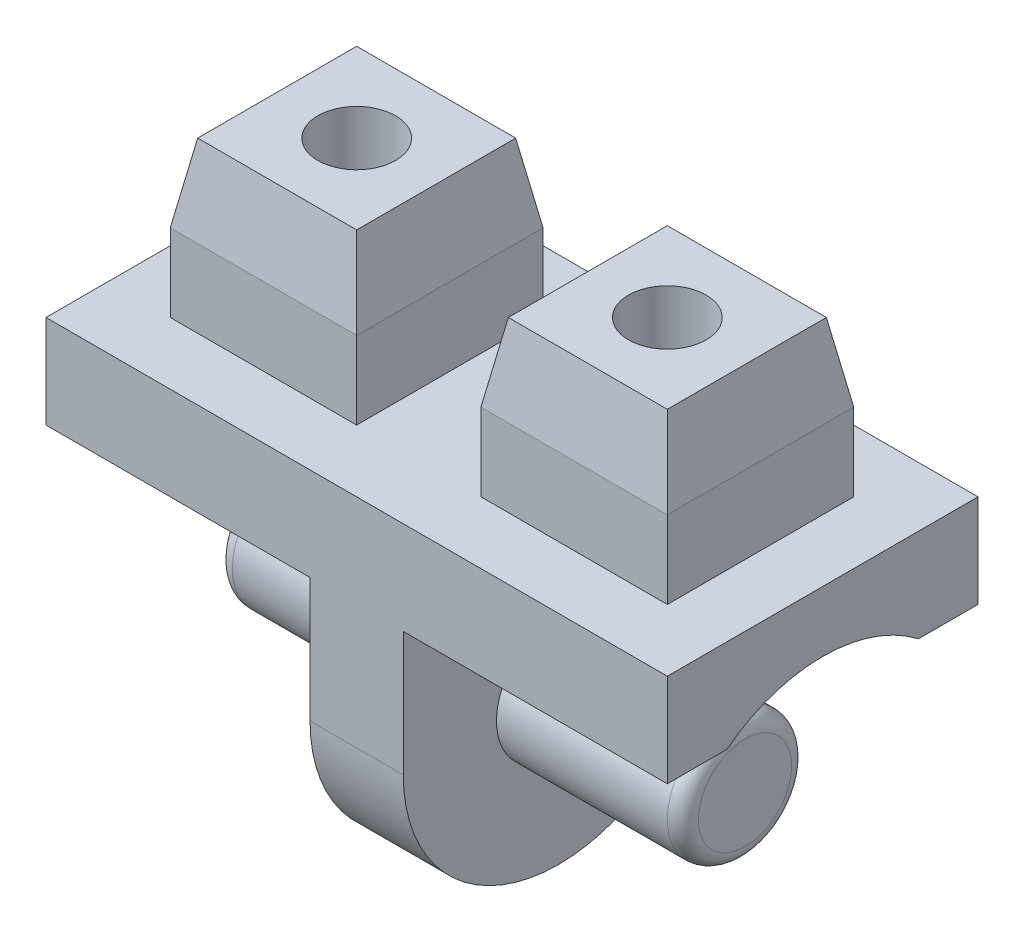
ISO-10303-21;
HEADER;
FILE_DESCRIPTION(('STEP AP214'),'2;1');
FILE_NAME('part.step','',(''),(''),'','','');
FILE_SCHEMA(('AUTOMOTIVE_DESIGN { 1 0 10303 214 1 1 1 1 }'));
ENDSEC;
DATA;
#1=APPLICATION_CONTEXT('core data for automotive mechanical design processes');
#2=APPLICATION_PROTOCOL_DEFINITION('international standard','automotive_design',2000,#1);
#3=PRODUCT_CONTEXT('',#1,'mechanical');
#4=PRODUCT('Part','Part','',(#3));
#5=PRODUCT_RELATED_PRODUCT_CATEGORY('part','',(#4));
#6=PRODUCT_DEFINITION_FORMATION('','',#4);
#7=PRODUCT_DEFINITION_CONTEXT('part definition',#1,'design');
#8=PRODUCT_DEFINITION('design','',#6,#7);
#9=PRODUCT_DEFINITION_SHAPE('','',#8);
#10=(LENGTH_UNIT() NAMED_UNIT(*) SI_UNIT(.MILLI.,.METRE.));
#11=(NAMED_UNIT(*) PLANE_ANGLE_UNIT() SI_UNIT($,.RADIAN.));
#12=(NAMED_UNIT(*) SI_UNIT($,.STERADIAN.) SOLID_ANGLE_UNIT());
#13=UNCERTAINTY_MEASURE_WITH_UNIT(LENGTH_MEASURE(1.E-05),#10,'distance_accuracy_value','');
#14=(GEOMETRIC_REPRESENTATION_CONTEXT(3) GLOBAL_UNCERTAINTY_ASSIGNED_CONTEXT((#13)) GLOBAL_UNIT_ASSIGNED_CONTEXT((#10,
#11,#12)) REPRESENTATION_CONTEXT('',''));
#15=CARTESIAN_POINT('',(0.,0.,0.));
#16=DIRECTION('',(0.,0.,1.));
#17=DIRECTION('',(1.,0.,0.));
#18=AXIS2_PLACEMENT_3D('',#15,#16,#17);
#19=CARTESIAN_POINT('',(3.,2.27002912474927,10.));
#20=DIRECTION('',(0.,-1.,0.));
#21=DIRECTION('',(0.,0.,-1.));
#22=AXIS2_PLACEMENT_3D('',#19,#20,#21);
#23=PLANE('',#22);
#24=DIRECTION('',(-1.,0.,0.));
#25=VECTOR('',#24,1.);
#26=CARTESIAN_POINT('',(3.,2.27002912474927,-10.));
#27=LINE('',#26,#25);
#28=CARTESIAN_POINT('',(20.,2.27002912474927,-10.));
#29=VERTEX_POINT('',#28);
#30=CARTESIAN_POINT('',(-20.,2.27002912474927,-10.));
#31=VERTEX_POINT('',#30);
#32=EDGE_CURVE('E416',#29,#31,#27,.T.);
#33=ORIENTED_EDGE('',*,*,#32,.T.);
#34=DIRECTION('',(0.,0.,1.));
#35=VECTOR('',#34,1.);
#36=CARTESIAN_POINT('',(-20.,2.27002912474927,10.));
#37=LINE('',#36,#35);
#38=CARTESIAN_POINT('',(-20.,2.27002912474927,10.));
#39=VERTEX_POINT('',#38);
#40=EDGE_CURVE('E283',#31,#39,#37,.T.);
#41=ORIENTED_EDGE('',*,*,#40,.T.);
#42=DIRECTION('',(-1.,0.,0.));
#43=VECTOR('',#42,1.);
#44=CARTESIAN_POINT('',(3.,2.27002912474927,10.));
#45=LINE('',#44,#43);
#46=CARTESIAN_POINT('',(20.,2.27002912474927,10.));
#47=VERTEX_POINT('',#46);
#48=EDGE_CURVE('E433',#47,#39,#45,.T.);
#49=ORIENTED_EDGE('',*,*,#48,.F.);
#50=DIRECTION('',(0.,0.,1.));
#51=VECTOR('',#50,1.);
#52=CARTESIAN_POINT('',(20.,2.27002912474927,10.));
#53=LINE('',#52,#51);
#54=EDGE_CURVE('E385',#29,#47,#53,.T.);
#55=ORIENTED_EDGE('',*,*,#54,.F.);
#56=EDGE_LOOP('',(#33,#41,#49,#55));
#57=FACE_BOUND('',#56,.T.);
#58=DIRECTION('',(0.,0.,1.));
#59=VECTOR('',#58,1.);
#60=CARTESIAN_POINT('',(4.,2.27002912474926,6.));
#61=LINE('',#60,#59);
#62=CARTESIAN_POINT('',(4.,2.27002912474927,-6.));
#63=VERTEX_POINT('',#62);
#64=CARTESIAN_POINT('',(4.,2.27002912474927,6.));
#65=VERTEX_POINT('',#64);
#66=EDGE_CURVE('E320',#63,#65,#61,.T.);
#67=ORIENTED_EDGE('',*,*,#66,.F.);
#68=DIRECTION('',(-1.,0.,0.));
#69=VECTOR('',#68,1.);
#70=CARTESIAN_POINT('',(4.,2.27002912474927,-6.));
#71=LINE('',#70,#69);
#72=CARTESIAN_POINT('',(16.,2.27002912474927,-6.));
#73=VERTEX_POINT('',#72);
#74=EDGE_CURVE('E342',#73,#63,#71,.T.);
#75=ORIENTED_EDGE('',*,*,#74,.F.);
#76=DIRECTION('',(0.,0.,-1.));
#77=VECTOR('',#76,1.);
#78=CARTESIAN_POINT('',(16.,2.27002912474926,6.));
#79=LINE('',#78,#77);
#80=CARTESIAN_POINT('',(16.,2.27002912474927,6.));
#81=VERTEX_POINT('',#80);
#82=EDGE_CURVE('E55',#81,#73,#79,.T.);
#83=ORIENTED_EDGE('',*,*,#82,.F.);
#84=DIRECTION('',(1.,0.,0.));
#85=VECTOR('',#84,1.);
#86=CARTESIAN_POINT('',(4.,2.27002912474926,6.));
#87=LINE('',#86,#85);
#88=EDGE_CURVE('E50',#65,#81,#87,.T.);
#89=ORIENTED_EDGE('',*,*,#88,.F.);
#90=EDGE_LOOP('',(#67,#75,#83,#89));
#91=FACE_BOUND('',#90,.T.);
#92=DIRECTION('',(0.,0.,1.));
#93=VECTOR('',#92,1.);
#94=CARTESIAN_POINT('',(-4.,2.27002912474926,6.));
#95=LINE('',#94,#93);
#96=CARTESIAN_POINT('',(-4.,2.27002912474927,-6.));
#97=VERTEX_POINT('',#96);
#98=CARTESIAN_POINT('',(-4.,2.27002912474927,6.));
#99=VERTEX_POINT('',#98);
#100=EDGE_CURVE('E219',#97,#99,#95,.T.);
#101=ORIENTED_EDGE('',*,*,#100,.T.);
#102=DIRECTION('',(-1.,0.,0.));
#103=VECTOR('',#102,1.);
#104=CARTESIAN_POINT('',(-4.,2.27002912474926,6.));
#105=LINE('',#104,#103);
#106=CARTESIAN_POINT('',(-16.,2.27002912474927,6.));
#107=VERTEX_POINT('',#106);
#108=EDGE_CURVE('E249',#99,#107,#105,.T.);
#109=ORIENTED_EDGE('',*,*,#108,.T.);
#110=DIRECTION('',(0.,0.,-1.));
#111=VECTOR('',#110,1.);
#112=CARTESIAN_POINT('',(-16.,2.27002912474926,6.));
#113=LINE('',#112,#111);
#114=CARTESIAN_POINT('',(-16.,2.27002912474927,-6.));
#115=VERTEX_POINT('',#114);
#116=EDGE_CURVE('E252',#107,#115,#113,.T.);
#117=ORIENTED_EDGE('',*,*,#116,.T.);
#118=DIRECTION('',(1.,0.,0.));
#119=VECTOR('',#118,1.);
#120=CARTESIAN_POINT('',(-4.,2.27002912474927,-6.));
#121=LINE('',#120,#119);
#122=EDGE_CURVE('E237',#115,#97,#121,.T.);
#123=ORIENTED_EDGE('',*,*,#122,.T.);
#124=EDGE_LOOP('',(#101,#109,#117,#123));
#125=FACE_BOUND('',#124,.T.);
#126=ADVANCED_FACE('F35',(#57,#91,#125),#23,.F.);
#127=CARTESIAN_POINT('',(3.,2.27002912474927,10.));
#128=DIRECTION('',(0.,0.,-1.));
#129=DIRECTION('',(0.,1.,0.));
#130=AXIS2_PLACEMENT_3D('',#127,#128,#129);
#131=PLANE('',#130);
#132=ORIENTED_EDGE('',*,*,#48,.T.);
#133=DIRECTION('',(0.,-1.,0.));
#134=VECTOR('',#133,1.);
#135=CARTESIAN_POINT('',(-20.,2.27002912474927,10.));
#136=LINE('',#135,#134);
#137=CARTESIAN_POINT('',(-20.,-3.72997087525073,10.));
#138=VERTEX_POINT('',#137);
#139=EDGE_CURVE('E268',#39,#138,#136,.T.);
#140=ORIENTED_EDGE('',*,*,#139,.T.);
#141=DIRECTION('',(1.,0.,0.));
#142=VECTOR('',#141,1.);
#143=CARTESIAN_POINT('',(-20.,-3.72997087525073,10.));
#144=LINE('',#143,#142);
#145=CARTESIAN_POINT('',(-3.,-3.72997087525073,10.));
#146=VERTEX_POINT('',#145);
#147=EDGE_CURVE('E451',#138,#146,#144,.T.);
#148=ORIENTED_EDGE('',*,*,#147,.T.);
#149=DIRECTION('',(0.,-1.,0.));
#150=VECTOR('',#149,1.);
#151=CARTESIAN_POINT('',(-3.,2.27002912474927,10.));
#152=LINE('',#151,#150);
#153=CARTESIAN_POINT('',(-3.,-11.7299708752507,9.99999999999999));
#154=VERTEX_POINT('',#153);
#155=EDGE_CURVE('E478',#146,#154,#152,.T.);
#156=ORIENTED_EDGE('',*,*,#155,.T.);
#157=DIRECTION('',(-1.,0.,0.));
#158=VECTOR('',#157,1.);
#159=CARTESIAN_POINT('',(3.,-11.7299708752507,9.99999999999999));
#160=LINE('',#159,#158);
#161=CARTESIAN_POINT('',(3.,-11.7299708752507,9.99999999999999));
#162=VERTEX_POINT('',#161);
#163=EDGE_CURVE('E406',#162,#154,#160,.T.);
#164=ORIENTED_EDGE('',*,*,#163,.F.);
#165=DIRECTION('',(0.,-1.,0.));
#166=VECTOR('',#165,1.);
#167=CARTESIAN_POINT('',(3.,2.27002912474927,10.));
#168=LINE('',#167,#166);
#169=CARTESIAN_POINT('',(3.,-3.72997087525073,10.));
#170=VERTEX_POINT('',#169);
#171=EDGE_CURVE('E420',#170,#162,#168,.T.);
#172=ORIENTED_EDGE('',*,*,#171,.F.);
#173=DIRECTION('',(-1.,0.,0.));
#174=VECTOR('',#173,1.);
#175=CARTESIAN_POINT('',(20.,-3.72997087525073,10.));
#176=LINE('',#175,#174);
#177=CARTESIAN_POINT('',(20.,-3.72997087525073,10.));
#178=VERTEX_POINT('',#177);
#179=EDGE_CURVE('E424',#178,#170,#176,.T.);
#180=ORIENTED_EDGE('',*,*,#179,.F.);
#181=DIRECTION('',(0.,-1.,0.));
#182=VECTOR('',#181,1.);
#183=CARTESIAN_POINT('',(20.,2.27002912474927,10.));
#184=LINE('',#183,#182);
#185=EDGE_CURVE('E372',#47,#178,#184,.T.);
#186=ORIENTED_EDGE('',*,*,#185,.F.);
#187=EDGE_LOOP('',(#132,#140,#148,#156,#164,#172,#180,#186));
#188=FACE_BOUND('',#187,.T.);
#189=ADVANCED_FACE('F449',(#188),#131,.F.);
#190=CARTESIAN_POINT('',(3.,-11.7299708752507,0.));
#191=DIRECTION('',(-1.,0.,0.));
#192=DIRECTION('',(0.,0.,1.));
#193=AXIS2_PLACEMENT_3D('',#190,#191,#192);
#194=CYLINDRICAL_SURFACE('',#193,10.);
#195=ORIENTED_EDGE('',*,*,#163,.T.);
#196=CARTESIAN_POINT('',(-3.,-11.7299708752507,0.));
#197=DIRECTION('',(1.,0.,0.));
#198=DIRECTION('',(0.,0.,-1.));
#199=AXIS2_PLACEMENT_3D('',#196,#197,#198);
#200=CIRCLE('',#199,10.);
#201=CARTESIAN_POINT('',(-3.,-11.7299708752507,-10.));
#202=VERTEX_POINT('',#201);
#203=EDGE_CURVE('E481',#154,#202,#200,.T.);
#204=ORIENTED_EDGE('',*,*,#203,.T.);
#205=DIRECTION('',(-1.,0.,0.));
#206=VECTOR('',#205,1.);
#207=CARTESIAN_POINT('',(3.,-11.7299708752507,-10.));
#208=LINE('',#207,#206);
#209=CARTESIAN_POINT('',(3.,-11.7299708752507,-10.));
#210=VERTEX_POINT('',#209);
#211=EDGE_CURVE('E409',#210,#202,#208,.T.);
#212=ORIENTED_EDGE('',*,*,#211,.F.);
#213=CARTESIAN_POINT('',(3.,-11.7299708752507,0.));
#214=DIRECTION('',(1.,0.,0.));
#215=DIRECTION('',(0.,0.,-1.));
#216=AXIS2_PLACEMENT_3D('',#213,#214,#215);
#217=CIRCLE('',#216,10.);
#218=EDGE_CURVE('E423',#162,#210,#217,.T.);
#219=ORIENTED_EDGE('',*,*,#218,.F.);
#220=EDGE_LOOP('',(#195,#204,#212,#219));
#221=FACE_BOUND('',#220,.T.);
#222=ADVANCED_FACE('F503',(#221),#194,.T.);
#223=CARTESIAN_POINT('',(3.,2.27002912474927,-10.));
#224=DIRECTION('',(0.,0.,1.));
#225=DIRECTION('',(0.,-1.,0.));
#226=AXIS2_PLACEMENT_3D('',#223,#224,#225);
#227=PLANE('',#226);
#228=ORIENTED_EDGE('',*,*,#211,.T.);
#229=DIRECTION('',(0.,1.,0.));
#230=VECTOR('',#229,1.);
#231=CARTESIAN_POINT('',(-3.,2.27002912474927,-10.));
#232=LINE('',#231,#230);
#233=CARTESIAN_POINT('',(-3.,-3.72997087525073,-10.));
#234=VERTEX_POINT('',#233);
#235=EDGE_CURVE('E307',#202,#234,#232,.T.);
#236=ORIENTED_EDGE('',*,*,#235,.T.);
#237=DIRECTION('',(1.,0.,0.));
#238=VECTOR('',#237,1.);
#239=CARTESIAN_POINT('',(-20.,-3.72997087525073,-10.));
#240=LINE('',#239,#238);
#241=CARTESIAN_POINT('',(-20.,-3.72997087525073,-10.));
#242=VERTEX_POINT('',#241);
#243=EDGE_CURVE('E286',#242,#234,#240,.T.);
#244=ORIENTED_EDGE('',*,*,#243,.F.);
#245=DIRECTION('',(0.,1.,0.));
#246=VECTOR('',#245,1.);
#247=CARTESIAN_POINT('',(-20.,2.27002912474927,-10.));
#248=LINE('',#247,#246);
#249=EDGE_CURVE('E280',#242,#31,#248,.T.);
#250=ORIENTED_EDGE('',*,*,#249,.T.);
#251=ORIENTED_EDGE('',*,*,#32,.F.);
#252=DIRECTION('',(0.,1.,0.));
#253=VECTOR('',#252,1.);
#254=CARTESIAN_POINT('',(20.,2.27002912474927,-10.));
#255=LINE('',#254,#253);
#256=CARTESIAN_POINT('',(20.,-3.72997087525073,-10.));
#257=VERTEX_POINT('',#256);
#258=EDGE_CURVE('E382',#257,#29,#255,.T.);
#259=ORIENTED_EDGE('',*,*,#258,.F.);
#260=DIRECTION('',(-1.,0.,0.));
#261=VECTOR('',#260,1.);
#262=CARTESIAN_POINT('',(20.,-3.72997087525073,-10.));
#263=LINE('',#262,#261);
#264=CARTESIAN_POINT('',(3.,-3.72997087525073,-10.));
#265=VERTEX_POINT('',#264);
#266=EDGE_CURVE('E388',#257,#265,#263,.T.);
#267=ORIENTED_EDGE('',*,*,#266,.T.);
#268=DIRECTION('',(0.,1.,0.));
#269=VECTOR('',#268,1.);
#270=CARTESIAN_POINT('',(3.,2.27002912474927,-10.));
#271=LINE('',#270,#269);
#272=EDGE_CURVE('E425',#210,#265,#271,.T.);
#273=ORIENTED_EDGE('',*,*,#272,.F.);
#274=EDGE_LOOP('',(#228,#236,#244,#250,#251,#259,#267,#273));
#275=FACE_BOUND('',#274,.T.);
#276=ADVANCED_FACE('F441',(#275),#227,.F.);
#277=CARTESIAN_POINT('',(3.,-11.7299708752507,0.));
#278=DIRECTION('',(1.,0.,0.));
#279=DIRECTION('',(0.,0.,-1.));
#280=AXIS2_PLACEMENT_3D('',#277,#278,#279);
#281=PLANE('',#280);
#282=CARTESIAN_POINT('',(3.,-11.7299708752508,0.));
#283=DIRECTION('',(1.,0.,0.));
#284=DIRECTION('',(0.,0.,-1.));
#285=AXIS2_PLACEMENT_3D('',#282,#283,#284);
#286=CIRCLE('',#285,4.);
#287=CARTESIAN_POINT('',(3.,-11.7299708752508,-4.));
#288=VERTEX_POINT('',#287);
#289=EDGE_CURVE('E368',#288,#288,#286,.T.);
#290=ORIENTED_EDGE('',*,*,#289,.F.);
#291=EDGE_LOOP('',(#290));
#292=FACE_BOUND('',#291,.T.);
#293=DIRECTION('',(0.,0.,-1.));
#294=VECTOR('',#293,1.);
#295=CARTESIAN_POINT('',(3.,-3.72997087525073,-10.));
#296=LINE('',#295,#294);
#297=CARTESIAN_POINT('',(3.,-3.72997087525073,-6.16522505671935));
#298=VERTEX_POINT('',#297);
#299=EDGE_CURVE('E376',#298,#265,#296,.T.);
#300=ORIENTED_EDGE('',*,*,#299,.F.);
#301=CARTESIAN_POINT('',(3.,-11.7299708752507,0.));
#302=DIRECTION('',(-1.,0.,0.));
#303=DIRECTION('',(0.,0.,1.));
#304=AXIS2_PLACEMENT_3D('',#301,#302,#303);
#305=CIRCLE('',#304,10.1);
#306=CARTESIAN_POINT('',(3.,-3.72997087525073,6.16522505671934));
#307=VERTEX_POINT('',#306);
#308=EDGE_CURVE('E389',#307,#298,#305,.T.);
#309=ORIENTED_EDGE('',*,*,#308,.F.);
#310=DIRECTION('',(0.,0.,-1.));
#311=VECTOR('',#310,1.);
#312=CARTESIAN_POINT('',(3.,-3.72997087525073,10.));
#313=LINE('',#312,#311);
#314=EDGE_CURVE('E371',#170,#307,#313,.T.);
#315=ORIENTED_EDGE('',*,*,#314,.F.);
#316=ORIENTED_EDGE('',*,*,#171,.T.);
#317=ORIENTED_EDGE('',*,*,#218,.T.);
#318=ORIENTED_EDGE('',*,*,#272,.T.);
#319=EDGE_LOOP('',(#300,#309,#315,#316,#317,#318));
#320=FACE_BOUND('',#319,.T.);
#321=ADVANCED_FACE('F464',(#292,#320),#281,.T.);
#322=CARTESIAN_POINT('',(20.,-3.72997087525073,10.));
#323=DIRECTION('',(0.,1.,0.));
#324=DIRECTION('',(0.,0.,1.));
#325=AXIS2_PLACEMENT_3D('',#322,#323,#324);
#326=PLANE('',#325);
#327=ORIENTED_EDGE('',*,*,#314,.T.);
#328=DIRECTION('',(-1.,0.,0.));
#329=VECTOR('',#328,1.);
#330=CARTESIAN_POINT('',(20.,-3.72997087525073,6.16522505671935));
#331=LINE('',#330,#329);
#332=CARTESIAN_POINT('',(20.,-3.72997087525073,6.16522505671935));
#333=VERTEX_POINT('',#332);
#334=EDGE_CURVE('E430',#333,#307,#331,.T.);
#335=ORIENTED_EDGE('',*,*,#334,.F.);
#336=DIRECTION('',(0.,0.,-1.));
#337=VECTOR('',#336,1.);
#338=CARTESIAN_POINT('',(20.,-3.72997087525073,10.));
#339=LINE('',#338,#337);
#340=EDGE_CURVE('E375',#178,#333,#339,.T.);
#341=ORIENTED_EDGE('',*,*,#340,.F.);
#342=ORIENTED_EDGE('',*,*,#179,.T.);
#343=EDGE_LOOP('',(#327,#335,#341,#342));
#344=FACE_BOUND('',#343,.T.);
#345=ADVANCED_FACE('F475',(#344),#326,.F.);
#346=CARTESIAN_POINT('',(20.,-11.7299708752507,0.));
#347=DIRECTION('',(-1.,0.,0.));
#348=DIRECTION('',(0.,0.,1.));
#349=AXIS2_PLACEMENT_3D('',#346,#347,#348);
#350=CYLINDRICAL_SURFACE('',#349,10.1);
#351=ORIENTED_EDGE('',*,*,#308,.T.);
#352=DIRECTION('',(-1.,0.,0.));
#353=VECTOR('',#352,1.);
#354=CARTESIAN_POINT('',(20.,-3.72997087525073,-6.16522505671935));
#355=LINE('',#354,#353);
#356=CARTESIAN_POINT('',(20.,-3.72997087525073,-6.16522505671935));
#357=VERTEX_POINT('',#356);
#358=EDGE_CURVE('E394',#357,#298,#355,.T.);
#359=ORIENTED_EDGE('',*,*,#358,.F.);
#360=CARTESIAN_POINT('',(20.,-11.7299708752507,0.));
#361=DIRECTION('',(-1.,0.,0.));
#362=DIRECTION('',(0.,0.,1.));
#363=AXIS2_PLACEMENT_3D('',#360,#361,#362);
#364=CIRCLE('',#363,10.1);
#365=EDGE_CURVE('E378',#333,#357,#364,.T.);
#366=ORIENTED_EDGE('',*,*,#365,.F.);
#367=ORIENTED_EDGE('',*,*,#334,.T.);
#368=EDGE_LOOP('',(#351,#359,#366,#367));
#369=FACE_BOUND('',#368,.T.);
#370=ADVANCED_FACE('F468',(#369),#350,.F.);
#371=CARTESIAN_POINT('',(20.,-3.72997087525073,-10.));
#372=DIRECTION('',(0.,1.,0.));
#373=DIRECTION('',(0.,0.,1.));
#374=AXIS2_PLACEMENT_3D('',#371,#372,#373);
#375=PLANE('',#374);
#376=ORIENTED_EDGE('',*,*,#299,.T.);
#377=ORIENTED_EDGE('',*,*,#266,.F.);
#378=DIRECTION('',(0.,0.,-1.));
#379=VECTOR('',#378,1.);
#380=CARTESIAN_POINT('',(20.,-3.72997087525073,-10.));
#381=LINE('',#380,#379);
#382=EDGE_CURVE('E380',#357,#257,#381,.T.);
#383=ORIENTED_EDGE('',*,*,#382,.F.);
#384=ORIENTED_EDGE('',*,*,#358,.T.);
#385=EDGE_LOOP('',(#376,#377,#383,#384));
#386=FACE_BOUND('',#385,.T.);
#387=ADVANCED_FACE('F460',(#386),#375,.F.);
#388=CARTESIAN_POINT('',(20.,-11.7299708752507,0.));
#389=DIRECTION('',(-1.,0.,0.));
#390=DIRECTION('',(0.,0.,1.));
#391=AXIS2_PLACEMENT_3D('',#388,#389,#390);
#392=PLANE('',#391);
#393=ORIENTED_EDGE('',*,*,#185,.T.);
#394=ORIENTED_EDGE('',*,*,#340,.T.);
#395=ORIENTED_EDGE('',*,*,#365,.T.);
#396=ORIENTED_EDGE('',*,*,#382,.T.);
#397=ORIENTED_EDGE('',*,*,#258,.T.);
#398=ORIENTED_EDGE('',*,*,#54,.T.);
#399=EDGE_LOOP('',(#393,#394,#395,#396,#397,#398));
#400=FACE_BOUND('',#399,.T.);
#401=ADVANCED_FACE('F455',(#400),#392,.F.);
#402=CARTESIAN_POINT('',(15.,-11.7299708752508,0.));
#403=DIRECTION('',(-1.,0.,0.));
#404=DIRECTION('',(0.,0.,1.));
#405=AXIS2_PLACEMENT_3D('',#402,#403,#404);
#406=CYLINDRICAL_SURFACE('',#405,4.);
#407=CARTESIAN_POINT('',(14.,-11.7299708752508,0.));
#408=DIRECTION('',(1.,0.,0.));
#409=DIRECTION('',(0.,0.,-1.));
#410=AXIS2_PLACEMENT_3D('',#407,#408,#409);
#411=CIRCLE('',#410,4.);
#412=CARTESIAN_POINT('',(14.,-11.7299708752508,-4.));
#413=VERTEX_POINT('',#412);
#414=EDGE_CURVE('E11',#413,#413,#411,.F.);
#415=ORIENTED_EDGE('',*,*,#414,.T.);
#416=EDGE_LOOP('',(#415));
#417=FACE_BOUND('',#416,.T.);
#418=ORIENTED_EDGE('',*,*,#289,.T.);
#419=EDGE_LOOP('',(#418));
#420=FACE_BOUND('',#419,.T.);
#421=ADVANCED_FACE('F527',(#417,#420),#406,.T.);
#422=CARTESIAN_POINT('',(15.,-11.7299708752508,0.));
#423=DIRECTION('',(1.,0.,0.));
#424=DIRECTION('',(0.,0.,-1.));
#425=AXIS2_PLACEMENT_3D('',#422,#423,#424);
#426=PLANE('',#425);
#427=CARTESIAN_POINT('',(15.,-11.7299708752508,0.));
#428=DIRECTION('',(1.,0.,0.));
#429=DIRECTION('',(0.,0.,-1.));
#430=AXIS2_PLACEMENT_3D('',#427,#428,#429);
#431=CIRCLE('',#430,3.);
#432=CARTESIAN_POINT('',(15.,-11.7299708752508,-3.));
#433=VERTEX_POINT('',#432);
#434=EDGE_CURVE('E43',#433,#433,#431,.T.);
#435=ORIENTED_EDGE('',*,*,#434,.T.);
#436=EDGE_LOOP('',(#435));
#437=FACE_BOUND('',#436,.T.);
#438=ADVANCED_FACE('F530',(#437),#426,.T.);
#439=CARTESIAN_POINT('',(4.,7.27002912474926,6.));
#440=DIRECTION('',(1.,0.,0.));
#441=DIRECTION('',(0.,0.,-1.));
#442=AXIS2_PLACEMENT_3D('',#439,#440,#441);
#443=PLANE('',#442);
#444=ORIENTED_EDGE('',*,*,#66,.T.);
#445=DIRECTION('',(0.,-1.,0.));
#446=VECTOR('',#445,1.);
#447=CARTESIAN_POINT('',(4.,7.27002912474926,6.));
#448=LINE('',#447,#446);
#449=CARTESIAN_POINT('',(4.,7.27002912474926,6.));
#450=VERTEX_POINT('',#449);
#451=EDGE_CURVE('E366',#450,#65,#448,.T.);
#452=ORIENTED_EDGE('',*,*,#451,.F.);
#453=DIRECTION('',(0.,0.,1.));
#454=VECTOR('',#453,1.);
#455=CARTESIAN_POINT('',(4.,7.27002912474926,6.));
#456=LINE('',#455,#454);
#457=CARTESIAN_POINT('',(4.,7.27002912474927,-6.));
#458=VERTEX_POINT('',#457);
#459=EDGE_CURVE('E338',#458,#450,#456,.T.);
#460=ORIENTED_EDGE('',*,*,#459,.F.);
#461=DIRECTION('',(0.,-1.,0.));
#462=VECTOR('',#461,1.);
#463=CARTESIAN_POINT('',(4.,7.27002912474927,-6.));
#464=LINE('',#463,#462);
#465=EDGE_CURVE('E351',#458,#63,#464,.T.);
#466=ORIENTED_EDGE('',*,*,#465,.T.);
#467=EDGE_LOOP('',(#444,#452,#460,#466));
#468=FACE_BOUND('',#467,.T.);
#469=ADVANCED_FACE('F534',(#468),#443,.F.);
#470=CARTESIAN_POINT('',(4.,7.27002912474926,6.));
#471=DIRECTION('',(0.,0.,-1.));
#472=DIRECTION('',(0.,1.,0.));
#473=AXIS2_PLACEMENT_3D('',#470,#471,#472);
#474=PLANE('',#473);
#475=ORIENTED_EDGE('',*,*,#88,.T.);
#476=DIRECTION('',(0.,-1.,0.));
#477=VECTOR('',#476,1.);
#478=CARTESIAN_POINT('',(16.,7.27002912474926,6.));
#479=LINE('',#478,#477);
#480=CARTESIAN_POINT('',(16.,7.27002912474926,6.));
#481=VERTEX_POINT('',#480);
#482=EDGE_CURVE('E363',#481,#81,#479,.T.);
#483=ORIENTED_EDGE('',*,*,#482,.F.);
#484=DIRECTION('',(1.,0.,0.));
#485=VECTOR('',#484,1.);
#486=CARTESIAN_POINT('',(4.,7.27002912474926,6.));
#487=LINE('',#486,#485);
#488=EDGE_CURVE('E341',#450,#481,#487,.T.);
#489=ORIENTED_EDGE('',*,*,#488,.F.);
#490=ORIENTED_EDGE('',*,*,#451,.T.);
#491=EDGE_LOOP('',(#475,#483,#489,#490));
#492=FACE_BOUND('',#491,.T.);
#493=ADVANCED_FACE('F537',(#492),#474,.F.);
#494=CARTESIAN_POINT('',(16.,7.27002912474926,6.));
#495=DIRECTION('',(-1.,0.,0.));
#496=DIRECTION('',(0.,0.,1.));
#497=AXIS2_PLACEMENT_3D('',#494,#495,#496);
#498=PLANE('',#497);
#499=ORIENTED_EDGE('',*,*,#82,.T.);
#500=DIRECTION('',(0.,-1.,0.));
#501=VECTOR('',#500,1.);
#502=CARTESIAN_POINT('',(16.,7.27002912474927,-6.));
#503=LINE('',#502,#501);
#504=CARTESIAN_POINT('',(16.,7.27002912474927,-6.));
#505=VERTEX_POINT('',#504);
#506=EDGE_CURVE('E360',#505,#73,#503,.T.);
#507=ORIENTED_EDGE('',*,*,#506,.F.);
#508=DIRECTION('',(0.,0.,-1.));
#509=VECTOR('',#508,1.);
#510=CARTESIAN_POINT('',(16.,7.27002912474926,6.));
#511=LINE('',#510,#509);
#512=EDGE_CURVE('E345',#481,#505,#511,.T.);
#513=ORIENTED_EDGE('',*,*,#512,.F.);
#514=ORIENTED_EDGE('',*,*,#482,.T.);
#515=EDGE_LOOP('',(#499,#507,#513,#514));
#516=FACE_BOUND('',#515,.T.);
#517=ADVANCED_FACE('F541',(#516),#498,.F.);
#518=CARTESIAN_POINT('',(4.,7.27002912474927,-6.));
#519=DIRECTION('',(0.,0.,1.));
#520=DIRECTION('',(0.,-1.,0.));
#521=AXIS2_PLACEMENT_3D('',#518,#519,#520);
#522=PLANE('',#521);
#523=ORIENTED_EDGE('',*,*,#74,.T.);
#524=ORIENTED_EDGE('',*,*,#465,.F.);
#525=DIRECTION('',(-1.,0.,0.));
#526=VECTOR('',#525,1.);
#527=CARTESIAN_POINT('',(4.,7.27002912474927,-6.));
#528=LINE('',#527,#526);
#529=EDGE_CURVE('E348',#505,#458,#528,.T.);
#530=ORIENTED_EDGE('',*,*,#529,.F.);
#531=ORIENTED_EDGE('',*,*,#506,.T.);
#532=EDGE_LOOP('',(#523,#524,#530,#531));
#533=FACE_BOUND('',#532,.T.);
#534=ADVANCED_FACE('F545',(#533),#522,.F.);
#535=CARTESIAN_POINT('',(4.,7.27002912474927,6.));
#536=DIRECTION('',(-0.984807753012208,0.17364817766693,0.));
#537=DIRECTION('',(-0.17364817766693,-0.984807753012208,0.));
#538=AXIS2_PLACEMENT_3D('',#535,#536,#537);
#539=PLANE('',#538);
#540=ORIENTED_EDGE('',*,*,#459,.T.);
#541=DIRECTION('',(-0.171087869746035,-0.970287525247814,0.171087869746036));
#542=VECTOR('',#541,1.);
#543=CARTESIAN_POINT('',(4.,7.27002912474927,6.));
#544=LINE('',#543,#542);
#545=CARTESIAN_POINT('',(4.88163490354232,12.2700291247493,5.11836509645768));
#546=VERTEX_POINT('',#545);
#547=EDGE_CURVE('E317',#546,#450,#544,.T.);
#548=ORIENTED_EDGE('',*,*,#547,.F.);
#549=DIRECTION('',(0.,0.,-1.));
#550=VECTOR('',#549,1.);
#551=CARTESIAN_POINT('',(4.88163490354232,12.2700291247493,0.));
#552=LINE('',#551,#550);
#553=CARTESIAN_POINT('',(4.88163490354232,12.2700291247493,-5.11836509645767));
#554=VERTEX_POINT('',#553);
#555=EDGE_CURVE('E316',#554,#546,#552,.F.);
#556=ORIENTED_EDGE('',*,*,#555,.F.);
#557=DIRECTION('',(-0.171087869746035,-0.970287525247814,-0.171087869746036));
#558=VECTOR('',#557,1.);
#559=CARTESIAN_POINT('',(4.35125271009084,9.26208223357888,-5.64874728990916));
#560=LINE('',#559,#558);
#561=EDGE_CURVE('E322',#554,#458,#560,.T.);
#562=ORIENTED_EDGE('',*,*,#561,.T.);
#563=EDGE_LOOP('',(#540,#548,#556,#562));
#564=FACE_BOUND('',#563,.T.);
#565=ADVANCED_FACE('F549',(#564),#539,.T.);
#566=CARTESIAN_POINT('',(4.,7.27002912474927,6.));
#567=DIRECTION('',(0.,0.17364817766693,0.984807753012208));
#568=DIRECTION('',(0.,-0.984807753012208,0.17364817766693));
#569=AXIS2_PLACEMENT_3D('',#566,#567,#568);
#570=PLANE('',#569);
#571=ORIENTED_EDGE('',*,*,#488,.T.);
#572=DIRECTION('',(0.171087869746036,-0.970287525247814,0.171087869746036));
#573=VECTOR('',#572,1.);
#574=CARTESIAN_POINT('',(16.,7.27002912474927,6.));
#575=LINE('',#574,#573);
#576=CARTESIAN_POINT('',(15.1183650964577,12.2700291247493,5.11836509645768));
#577=VERTEX_POINT('',#576);
#578=EDGE_CURVE('E321',#577,#481,#575,.T.);
#579=ORIENTED_EDGE('',*,*,#578,.F.);
#580=DIRECTION('',(-1.,0.,0.));
#581=VECTOR('',#580,1.);
#582=CARTESIAN_POINT('',(0.,12.2700291247493,5.11836509645768));
#583=LINE('',#582,#581);
#584=EDGE_CURVE('E333',#546,#577,#583,.F.);
#585=ORIENTED_EDGE('',*,*,#584,.F.);
#586=ORIENTED_EDGE('',*,*,#547,.T.);
#587=EDGE_LOOP('',(#571,#579,#585,#586));
#588=FACE_BOUND('',#587,.T.);
#589=ADVANCED_FACE('F551',(#588),#570,.T.);
#590=CARTESIAN_POINT('',(16.,7.27002912474927,6.));
#591=DIRECTION('',(0.984807753012208,0.173648177666931,0.));
#592=DIRECTION('',(-0.173648177666931,0.984807753012208,0.));
#593=AXIS2_PLACEMENT_3D('',#590,#591,#592);
#594=PLANE('',#593);
#595=ORIENTED_EDGE('',*,*,#512,.T.);
#596=DIRECTION('',(0.171087869746036,-0.970287525247814,-0.171087869746036));
#597=VECTOR('',#596,1.);
#598=CARTESIAN_POINT('',(15.6487472899092,9.26208223357888,-5.64874728990916));
#599=LINE('',#598,#597);
#600=CARTESIAN_POINT('',(15.1183650964577,12.2700291247493,-5.11836509645767));
#601=VERTEX_POINT('',#600);
#602=EDGE_CURVE('E325',#601,#505,#599,.T.);
#603=ORIENTED_EDGE('',*,*,#602,.F.);
#604=DIRECTION('',(0.,0.,1.));
#605=VECTOR('',#604,1.);
#606=CARTESIAN_POINT('',(15.1183650964577,12.2700291247493,0.));
#607=LINE('',#606,#605);
#608=EDGE_CURVE('E335',#577,#601,#607,.F.);
#609=ORIENTED_EDGE('',*,*,#608,.F.);
#610=ORIENTED_EDGE('',*,*,#578,.T.);
#611=EDGE_LOOP('',(#595,#603,#609,#610));
#612=FACE_BOUND('',#611,.T.);
#613=ADVANCED_FACE('F554',(#612),#594,.T.);
#614=CARTESIAN_POINT('',(4.,7.27002912474927,-6.));
#615=DIRECTION('',(0.,0.17364817766693,-0.984807753012208));
#616=DIRECTION('',(0.,0.984807753012208,0.17364817766693));
#617=AXIS2_PLACEMENT_3D('',#614,#615,#616);
#618=PLANE('',#617);
#619=ORIENTED_EDGE('',*,*,#529,.T.);
#620=ORIENTED_EDGE('',*,*,#561,.F.);
#621=DIRECTION('',(1.,0.,0.));
#622=VECTOR('',#621,1.);
#623=CARTESIAN_POINT('',(0.,12.2700291247493,-5.11836509645767));
#624=LINE('',#623,#622);
#625=EDGE_CURVE('E326',#601,#554,#624,.F.);
#626=ORIENTED_EDGE('',*,*,#625,.F.);
#627=ORIENTED_EDGE('',*,*,#602,.T.);
#628=EDGE_LOOP('',(#619,#620,#626,#627));
#629=FACE_BOUND('',#628,.T.);
#630=ADVANCED_FACE('F558',(#629),#618,.T.);
#631=CARTESIAN_POINT('',(0.,12.2700291247493,0.));
#632=DIRECTION('',(0.,-1.,0.));
#633=DIRECTION('',(1.,0.,0.));
#634=AXIS2_PLACEMENT_3D('',#631,#632,#633);
#635=PLANE('',#634);
#636=CARTESIAN_POINT('',(10.,12.2700291247493,0.));
#637=DIRECTION('',(0.,1.,0.));
#638=DIRECTION('',(0.,0.,1.));
#639=AXIS2_PLACEMENT_3D('',#636,#637,#638);
#640=CIRCLE('',#639,2.5);
#641=CARTESIAN_POINT('',(10.,12.2700291247493,2.5));
#642=VERTEX_POINT('',#641);
#643=EDGE_CURVE('E310',#642,#642,#640,.T.);
#644=ORIENTED_EDGE('',*,*,#643,.F.);
#645=EDGE_LOOP('',(#644));
#646=FACE_BOUND('',#645,.T.);
#647=ORIENTED_EDGE('',*,*,#555,.T.);
#648=ORIENTED_EDGE('',*,*,#584,.T.);
#649=ORIENTED_EDGE('',*,*,#608,.T.);
#650=ORIENTED_EDGE('',*,*,#625,.T.);
#651=EDGE_LOOP('',(#647,#648,#649,#650));
#652=FACE_BOUND('',#651,.T.);
#653=ADVANCED_FACE('F562',(#646,#652),#635,.F.);
#654=CARTESIAN_POINT('',(10.,5.27002912474927,0.));
#655=DIRECTION('',(0.,1.,0.));
#656=DIRECTION('',(0.,0.,1.));
#657=AXIS2_PLACEMENT_3D('',#654,#655,#656);
#658=CONICAL_SURFACE('',#657,2.5,1.02974425867665);
#659=CARTESIAN_POINT('',(10.,3.76787757718037,0.));
#660=VERTEX_POINT('',#659);
#661=VERTEX_LOOP('',#660);
#662=FACE_BOUND('',#661,.T.);
#663=CARTESIAN_POINT('',(10.,5.27002912474927,0.));
#664=DIRECTION('',(0.,1.,0.));
#665=DIRECTION('',(0.,0.,1.));
#666=AXIS2_PLACEMENT_3D('',#663,#664,#665);
#667=CIRCLE('',#666,2.5);
#668=CARTESIAN_POINT('',(10.,5.27002912474927,2.5));
#669=VERTEX_POINT('',#668);
#670=EDGE_CURVE('E313',#669,#669,#667,.T.);
#671=ORIENTED_EDGE('',*,*,#670,.T.);
#672=EDGE_LOOP('',(#671));
#673=FACE_BOUND('',#672,.T.);
#674=ADVANCED_FACE('F569',(#662,#673),#658,.F.);
#675=CARTESIAN_POINT('',(10.,12.2700291247493,0.));
#676=DIRECTION('',(0.,1.,0.));
#677=DIRECTION('',(0.,0.,1.));
#678=AXIS2_PLACEMENT_3D('',#675,#676,#677);
#679=CYLINDRICAL_SURFACE('',#678,2.5);
#680=ORIENTED_EDGE('',*,*,#670,.F.);
#681=EDGE_LOOP('',(#680));
#682=FACE_BOUND('',#681,.T.);
#683=ORIENTED_EDGE('',*,*,#643,.T.);
#684=EDGE_LOOP('',(#683));
#685=FACE_BOUND('',#684,.T.);
#686=ADVANCED_FACE('F573',(#682,#685),#679,.F.);
#687=CARTESIAN_POINT('',(14.,-11.7299708752508,0.));
#688=DIRECTION('',(1.,0.,0.));
#689=DIRECTION('',(0.,0.,-1.));
#690=AXIS2_PLACEMENT_3D('',#687,#688,#689);
#691=TOROIDAL_SURFACE('',#690,3.,1.);
#692=ORIENTED_EDGE('',*,*,#414,.F.);
#693=EDGE_LOOP('',(#692));
#694=FACE_BOUND('',#693,.T.);
#695=ORIENTED_EDGE('',*,*,#434,.F.);
#696=EDGE_LOOP('',(#695));
#697=FACE_BOUND('',#696,.T.);
#698=ADVANCED_FACE('F37',(#694,#697),#691,.T.);
#699=CARTESIAN_POINT('',(-3.,-11.7299708752507,0.));
#700=DIRECTION('',(-1.,0.,0.));
#701=DIRECTION('',(0.,0.,-1.));
#702=AXIS2_PLACEMENT_3D('',#699,#700,#701);
#703=PLANE('',#702);
#704=CARTESIAN_POINT('',(-3.,-11.7299708752508,0.));
#705=DIRECTION('',(1.,0.,0.));
#706=DIRECTION('',(0.,0.,-1.));
#707=AXIS2_PLACEMENT_3D('',#704,#705,#706);
#708=CIRCLE('',#707,4.);
#709=CARTESIAN_POINT('',(-3.,-11.7299708752508,-4.));
#710=VERTEX_POINT('',#709);
#711=EDGE_CURVE('E264',#710,#710,#708,.T.);
#712=ORIENTED_EDGE('',*,*,#711,.T.);
#713=EDGE_LOOP('',(#712));
#714=FACE_BOUND('',#713,.T.);
#715=DIRECTION('',(0.,0.,-1.));
#716=VECTOR('',#715,1.);
#717=CARTESIAN_POINT('',(-3.,-3.72997087525073,-10.));
#718=LINE('',#717,#716);
#719=CARTESIAN_POINT('',(-3.,-3.72997087525073,-6.16522505671935));
#720=VERTEX_POINT('',#719);
#721=EDGE_CURVE('E272',#720,#234,#718,.T.);
#722=ORIENTED_EDGE('',*,*,#721,.T.);
#723=ORIENTED_EDGE('',*,*,#235,.F.);
#724=ORIENTED_EDGE('',*,*,#203,.F.);
#725=ORIENTED_EDGE('',*,*,#155,.F.);
#726=DIRECTION('',(0.,0.,-1.));
#727=VECTOR('',#726,1.);
#728=CARTESIAN_POINT('',(-3.,-3.72997087525073,10.));
#729=LINE('',#728,#727);
#730=CARTESIAN_POINT('',(-3.,-3.72997087525073,6.16522505671934));
#731=VERTEX_POINT('',#730);
#732=EDGE_CURVE('E267',#146,#731,#729,.T.);
#733=ORIENTED_EDGE('',*,*,#732,.T.);
#734=CARTESIAN_POINT('',(-3.,-11.7299708752507,0.));
#735=DIRECTION('',(-1.,0.,0.));
#736=DIRECTION('',(0.,0.,1.));
#737=AXIS2_PLACEMENT_3D('',#734,#735,#736);
#738=CIRCLE('',#737,10.1);
#739=EDGE_CURVE('E287',#731,#720,#738,.T.);
#740=ORIENTED_EDGE('',*,*,#739,.T.);
#741=EDGE_LOOP('',(#722,#723,#724,#725,#733,#740));
#742=FACE_BOUND('',#741,.T.);
#743=ADVANCED_FACE('F499',(#714,#742),#703,.T.);
#744=CARTESIAN_POINT('',(-20.,-3.72997087525073,10.));
#745=DIRECTION('',(0.,1.,0.));
#746=DIRECTION('',(0.,0.,1.));
#747=AXIS2_PLACEMENT_3D('',#744,#745,#746);
#748=PLANE('',#747);
#749=ORIENTED_EDGE('',*,*,#732,.F.);
#750=ORIENTED_EDGE('',*,*,#147,.F.);
#751=DIRECTION('',(0.,0.,-1.));
#752=VECTOR('',#751,1.);
#753=CARTESIAN_POINT('',(-20.,-3.72997087525073,10.));
#754=LINE('',#753,#752);
#755=CARTESIAN_POINT('',(-20.,-3.72997087525073,6.16522505671935));
#756=VERTEX_POINT('',#755);
#757=EDGE_CURVE('E271',#138,#756,#754,.T.);
#758=ORIENTED_EDGE('',*,*,#757,.T.);
#759=DIRECTION('',(1.,0.,0.));
#760=VECTOR('',#759,1.);
#761=CARTESIAN_POINT('',(-20.,-3.72997087525073,6.16522505671935));
#762=LINE('',#761,#760);
#763=EDGE_CURVE('E484',#756,#731,#762,.T.);
#764=ORIENTED_EDGE('',*,*,#763,.T.);
#765=EDGE_LOOP('',(#749,#750,#758,#764));
#766=FACE_BOUND('',#765,.T.);
#767=ADVANCED_FACE('F584',(#766),#748,.F.);
#768=CARTESIAN_POINT('',(-20.,-11.7299708752507,0.));
#769=DIRECTION('',(1.,0.,0.));
#770=DIRECTION('',(0.,0.,1.));
#771=AXIS2_PLACEMENT_3D('',#768,#769,#770);
#772=CYLINDRICAL_SURFACE('',#771,10.1);
#773=ORIENTED_EDGE('',*,*,#739,.F.);
#774=ORIENTED_EDGE('',*,*,#763,.F.);
#775=CARTESIAN_POINT('',(-20.,-11.7299708752507,0.));
#776=DIRECTION('',(-1.,0.,0.));
#777=DIRECTION('',(0.,0.,1.));
#778=AXIS2_PLACEMENT_3D('',#775,#776,#777);
#779=CIRCLE('',#778,10.1);
#780=CARTESIAN_POINT('',(-20.,-3.72997087525073,-6.16522505671935));
#781=VERTEX_POINT('',#780);
#782=EDGE_CURVE('E275',#756,#781,#779,.T.);
#783=ORIENTED_EDGE('',*,*,#782,.T.);
#784=DIRECTION('',(1.,0.,0.));
#785=VECTOR('',#784,1.);
#786=CARTESIAN_POINT('',(-20.,-3.72997087525073,-6.16522505671935));
#787=LINE('',#786,#785);
#788=EDGE_CURVE('E292',#781,#720,#787,.T.);
#789=ORIENTED_EDGE('',*,*,#788,.T.);
#790=EDGE_LOOP('',(#773,#774,#783,#789));
#791=FACE_BOUND('',#790,.T.);
#792=ADVANCED_FACE('F496',(#791),#772,.F.);
#793=CARTESIAN_POINT('',(-20.,-3.72997087525073,-10.));
#794=DIRECTION('',(0.,1.,0.));
#795=DIRECTION('',(0.,0.,1.));
#796=AXIS2_PLACEMENT_3D('',#793,#794,#795);
#797=PLANE('',#796);
#798=ORIENTED_EDGE('',*,*,#721,.F.);
#799=ORIENTED_EDGE('',*,*,#788,.F.);
#800=DIRECTION('',(0.,0.,-1.));
#801=VECTOR('',#800,1.);
#802=CARTESIAN_POINT('',(-20.,-3.72997087525073,-10.));
#803=LINE('',#802,#801);
#804=EDGE_CURVE('E278',#781,#242,#803,.T.);
#805=ORIENTED_EDGE('',*,*,#804,.T.);
#806=ORIENTED_EDGE('',*,*,#243,.T.);
#807=EDGE_LOOP('',(#798,#799,#805,#806));
#808=FACE_BOUND('',#807,.T.);
#809=ADVANCED_FACE('F501',(#808),#797,.F.);
#810=CARTESIAN_POINT('',(-20.,-11.7299708752507,0.));
#811=DIRECTION('',(1.,0.,0.));
#812=DIRECTION('',(0.,0.,1.));
#813=AXIS2_PLACEMENT_3D('',#810,#811,#812);
#814=PLANE('',#813);
#815=ORIENTED_EDGE('',*,*,#139,.F.);
#816=ORIENTED_EDGE('',*,*,#40,.F.);
#817=ORIENTED_EDGE('',*,*,#249,.F.);
#818=ORIENTED_EDGE('',*,*,#804,.F.);
#819=ORIENTED_EDGE('',*,*,#782,.F.);
#820=ORIENTED_EDGE('',*,*,#757,.F.);
#821=EDGE_LOOP('',(#815,#816,#817,#818,#819,#820));
#822=FACE_BOUND('',#821,.T.);
#823=ADVANCED_FACE('F445',(#822),#814,.F.);
#824=CARTESIAN_POINT('',(-15.,-11.7299708752508,0.));
#825=DIRECTION('',(1.,0.,0.));
#826=DIRECTION('',(0.,0.,1.));
#827=AXIS2_PLACEMENT_3D('',#824,#825,#826);
#828=CYLINDRICAL_SURFACE('',#827,4.);
#829=CARTESIAN_POINT('',(-14.,-11.7299708752508,0.));
#830=DIRECTION('',(1.,0.,0.));
#831=DIRECTION('',(0.,0.,-1.));
#832=AXIS2_PLACEMENT_3D('',#829,#830,#831);
#833=CIRCLE('',#832,4.);
#834=CARTESIAN_POINT('',(-14.,-11.7299708752508,-4.));
#835=VERTEX_POINT('',#834);
#836=EDGE_CURVE('E306',#835,#835,#833,.F.);
#837=ORIENTED_EDGE('',*,*,#836,.F.);
#838=EDGE_LOOP('',(#837));
#839=FACE_BOUND('',#838,.T.);
#840=ORIENTED_EDGE('',*,*,#711,.F.);
#841=EDGE_LOOP('',(#840));
#842=FACE_BOUND('',#841,.T.);
#843=ADVANCED_FACE('F594',(#839,#842),#828,.T.);
#844=CARTESIAN_POINT('',(-15.,-11.7299708752508,0.));
#845=DIRECTION('',(-1.,0.,0.));
#846=DIRECTION('',(0.,0.,-1.));
#847=AXIS2_PLACEMENT_3D('',#844,#845,#846);
#848=PLANE('',#847);
#849=CARTESIAN_POINT('',(-15.,-11.7299708752508,0.));
#850=DIRECTION('',(1.,0.,0.));
#851=DIRECTION('',(0.,0.,-1.));
#852=AXIS2_PLACEMENT_3D('',#849,#850,#851);
#853=CIRCLE('',#852,3.);
#854=CARTESIAN_POINT('',(-15.,-11.7299708752508,-3.));
#855=VERTEX_POINT('',#854);
#856=EDGE_CURVE('E303',#855,#855,#853,.T.);
#857=ORIENTED_EDGE('',*,*,#856,.F.);
#858=EDGE_LOOP('',(#857));
#859=FACE_BOUND('',#858,.T.);
#860=ADVANCED_FACE('F597',(#859),#848,.T.);
#861=CARTESIAN_POINT('',(-4.,7.27002912474926,6.));
#862=DIRECTION('',(-1.,0.,0.));
#863=DIRECTION('',(0.,0.,-1.));
#864=AXIS2_PLACEMENT_3D('',#861,#862,#863);
#865=PLANE('',#864);
#866=ORIENTED_EDGE('',*,*,#100,.F.);
#867=DIRECTION('',(0.,-1.,0.));
#868=VECTOR('',#867,1.);
#869=CARTESIAN_POINT('',(-4.,7.27002912474927,-6.));
#870=LINE('',#869,#868);
#871=CARTESIAN_POINT('',(-4.,7.27002912474927,-6.));
#872=VERTEX_POINT('',#871);
#873=EDGE_CURVE('E246',#872,#97,#870,.T.);
#874=ORIENTED_EDGE('',*,*,#873,.F.);
#875=DIRECTION('',(0.,0.,1.));
#876=VECTOR('',#875,1.);
#877=CARTESIAN_POINT('',(-4.,7.27002912474926,6.));
#878=LINE('',#877,#876);
#879=CARTESIAN_POINT('',(-4.,7.27002912474926,6.));
#880=VERTEX_POINT('',#879);
#881=EDGE_CURVE('E233',#872,#880,#878,.T.);
#882=ORIENTED_EDGE('',*,*,#881,.T.);
#883=DIRECTION('',(0.,-1.,0.));
#884=VECTOR('',#883,1.);
#885=CARTESIAN_POINT('',(-4.,7.27002912474926,6.));
#886=LINE('',#885,#884);
#887=EDGE_CURVE('E262',#880,#99,#886,.T.);
#888=ORIENTED_EDGE('',*,*,#887,.T.);
#889=EDGE_LOOP('',(#866,#874,#882,#888));
#890=FACE_BOUND('',#889,.T.);
#891=ADVANCED_FACE('F601',(#890),#865,.F.);
#892=CARTESIAN_POINT('',(-4.,7.27002912474926,6.));
#893=DIRECTION('',(0.,0.,-1.));
#894=DIRECTION('',(0.,1.,0.));
#895=AXIS2_PLACEMENT_3D('',#892,#893,#894);
#896=PLANE('',#895);
#897=ORIENTED_EDGE('',*,*,#108,.F.);
#898=ORIENTED_EDGE('',*,*,#887,.F.);
#899=DIRECTION('',(-1.,0.,0.));
#900=VECTOR('',#899,1.);
#901=CARTESIAN_POINT('',(-4.,7.27002912474926,6.));
#902=LINE('',#901,#900);
#903=CARTESIAN_POINT('',(-16.,7.27002912474926,6.));
#904=VERTEX_POINT('',#903);
#905=EDGE_CURVE('E236',#880,#904,#902,.T.);
#906=ORIENTED_EDGE('',*,*,#905,.T.);
#907=DIRECTION('',(0.,-1.,0.));
#908=VECTOR('',#907,1.);
#909=CARTESIAN_POINT('',(-16.,7.27002912474926,6.));
#910=LINE('',#909,#908);
#911=EDGE_CURVE('E260',#904,#107,#910,.T.);
#912=ORIENTED_EDGE('',*,*,#911,.T.);
#913=EDGE_LOOP('',(#897,#898,#906,#912));
#914=FACE_BOUND('',#913,.T.);
#915=ADVANCED_FACE('F605',(#914),#896,.F.);
#916=CARTESIAN_POINT('',(-16.,7.27002912474926,6.));
#917=DIRECTION('',(1.,0.,0.));
#918=DIRECTION('',(0.,0.,1.));
#919=AXIS2_PLACEMENT_3D('',#916,#917,#918);
#920=PLANE('',#919);
#921=ORIENTED_EDGE('',*,*,#116,.F.);
#922=ORIENTED_EDGE('',*,*,#911,.F.);
#923=DIRECTION('',(0.,0.,-1.));
#924=VECTOR('',#923,1.);
#925=CARTESIAN_POINT('',(-16.,7.27002912474926,6.));
#926=LINE('',#925,#924);
#927=CARTESIAN_POINT('',(-16.,7.27002912474927,-6.));
#928=VERTEX_POINT('',#927);
#929=EDGE_CURVE('E240',#904,#928,#926,.T.);
#930=ORIENTED_EDGE('',*,*,#929,.T.);
#931=DIRECTION('',(0.,-1.,0.));
#932=VECTOR('',#931,1.);
#933=CARTESIAN_POINT('',(-16.,7.27002912474927,-6.));
#934=LINE('',#933,#932);
#935=EDGE_CURVE('E258',#928,#115,#934,.T.);
#936=ORIENTED_EDGE('',*,*,#935,.T.);
#937=EDGE_LOOP('',(#921,#922,#930,#936));
#938=FACE_BOUND('',#937,.T.);
#939=ADVANCED_FACE('F609',(#938),#920,.F.);
#940=CARTESIAN_POINT('',(-4.,7.27002912474927,-6.));
#941=DIRECTION('',(0.,0.,1.));
#942=DIRECTION('',(0.,-1.,0.));
#943=AXIS2_PLACEMENT_3D('',#940,#941,#942);
#944=PLANE('',#943);
#945=ORIENTED_EDGE('',*,*,#122,.F.);
#946=ORIENTED_EDGE('',*,*,#935,.F.);
#947=DIRECTION('',(1.,0.,0.));
#948=VECTOR('',#947,1.);
#949=CARTESIAN_POINT('',(-4.,7.27002912474927,-6.));
#950=LINE('',#949,#948);
#951=EDGE_CURVE('E243',#928,#872,#950,.T.);
#952=ORIENTED_EDGE('',*,*,#951,.T.);
#953=ORIENTED_EDGE('',*,*,#873,.T.);
#954=EDGE_LOOP('',(#945,#946,#952,#953));
#955=FACE_BOUND('',#954,.T.);
#956=ADVANCED_FACE('F613',(#955),#944,.F.);
#957=CARTESIAN_POINT('',(-4.,7.27002912474927,6.));
#958=DIRECTION('',(0.984807753012208,0.17364817766693,0.));
#959=DIRECTION('',(0.17364817766693,-0.984807753012208,0.));
#960=AXIS2_PLACEMENT_3D('',#957,#958,#959);
#961=PLANE('',#960);
#962=ORIENTED_EDGE('',*,*,#881,.F.);
#963=DIRECTION('',(0.171087869746035,-0.970287525247814,-0.171087869746036));
#964=VECTOR('',#963,1.);
#965=CARTESIAN_POINT('',(-4.35125271009084,9.26208223357888,-5.64874728990916));
#966=LINE('',#965,#964);
#967=CARTESIAN_POINT('',(-4.88163490354232,12.2700291247493,-5.11836509645767));
#968=VERTEX_POINT('',#967);
#969=EDGE_CURVE('E221',#968,#872,#966,.T.);
#970=ORIENTED_EDGE('',*,*,#969,.F.);
#971=DIRECTION('',(0.,0.,-1.));
#972=VECTOR('',#971,1.);
#973=CARTESIAN_POINT('',(-4.88163490354232,12.2700291247493,0.));
#974=LINE('',#973,#972);
#975=CARTESIAN_POINT('',(-4.88163490354232,12.2700291247493,5.11836509645768));
#976=VERTEX_POINT('',#975);
#977=EDGE_CURVE('E208',#968,#976,#974,.F.);
#978=ORIENTED_EDGE('',*,*,#977,.T.);
#979=DIRECTION('',(0.171087869746035,-0.970287525247814,0.171087869746036));
#980=VECTOR('',#979,1.);
#981=CARTESIAN_POINT('',(-4.,7.27002912474927,6.));
#982=LINE('',#981,#980);
#983=EDGE_CURVE('E217',#976,#880,#982,.T.);
#984=ORIENTED_EDGE('',*,*,#983,.T.);
#985=EDGE_LOOP('',(#962,#970,#978,#984));
#986=FACE_BOUND('',#985,.T.);
#987=ADVANCED_FACE('F617',(#986),#961,.T.);
#988=CARTESIAN_POINT('',(-4.,7.27002912474927,6.));
#989=DIRECTION('',(0.,0.17364817766693,0.984807753012208));
#990=DIRECTION('',(0.,-0.984807753012208,0.17364817766693));
#991=AXIS2_PLACEMENT_3D('',#988,#989,#990);
#992=PLANE('',#991);
#993=ORIENTED_EDGE('',*,*,#905,.F.);
#994=ORIENTED_EDGE('',*,*,#983,.F.);
#995=DIRECTION('',(1.,0.,0.));
#996=VECTOR('',#995,1.);
#997=CARTESIAN_POINT('',(0.,12.2700291247493,5.11836509645768));
#998=LINE('',#997,#996);
#999=CARTESIAN_POINT('',(-15.1183650964577,12.2700291247493,5.11836509645768));
#1000=VERTEX_POINT('',#999);
#1001=EDGE_CURVE('E212',#976,#1000,#998,.F.);
#1002=ORIENTED_EDGE('',*,*,#1001,.T.);
#1003=DIRECTION('',(-0.171087869746036,-0.970287525247814,0.171087869746036));
#1004=VECTOR('',#1003,1.);
#1005=CARTESIAN_POINT('',(-16.,7.27002912474927,6.));
#1006=LINE('',#1005,#1004);
#1007=EDGE_CURVE('E220',#1000,#904,#1006,.T.);
#1008=ORIENTED_EDGE('',*,*,#1007,.T.);
#1009=EDGE_LOOP('',(#993,#994,#1002,#1008));
#1010=FACE_BOUND('',#1009,.T.);
#1011=ADVANCED_FACE('F619',(#1010),#992,.T.);
#1012=CARTESIAN_POINT('',(-16.,7.27002912474927,6.));
#1013=DIRECTION('',(-0.984807753012208,0.173648177666931,0.));
#1014=DIRECTION('',(0.173648177666931,0.984807753012208,0.));
#1015=AXIS2_PLACEMENT_3D('',#1012,#1013,#1014);
#1016=PLANE('',#1015);
#1017=ORIENTED_EDGE('',*,*,#929,.F.);
#1018=ORIENTED_EDGE('',*,*,#1007,.F.);
#1019=DIRECTION('',(0.,0.,1.));
#1020=VECTOR('',#1019,1.);
#1021=CARTESIAN_POINT('',(-15.1183650964577,12.2700291247493,0.));
#1022=LINE('',#1021,#1020);
#1023=CARTESIAN_POINT('',(-15.1183650964577,12.2700291247493,-5.11836509645767));
#1024=VERTEX_POINT('',#1023);
#1025=EDGE_CURVE('E229',#1000,#1024,#1022,.F.);
#1026=ORIENTED_EDGE('',*,*,#1025,.T.);
#1027=DIRECTION('',(-0.171087869746036,-0.970287525247814,-0.171087869746036));
#1028=VECTOR('',#1027,1.);
#1029=CARTESIAN_POINT('',(-15.6487472899092,9.26208223357888,-5.64874728990916));
#1030=LINE('',#1029,#1028);
#1031=EDGE_CURVE('E223',#1024,#928,#1030,.T.);
#1032=ORIENTED_EDGE('',*,*,#1031,.T.);
#1033=EDGE_LOOP('',(#1017,#1018,#1026,#1032));
#1034=FACE_BOUND('',#1033,.T.);
#1035=ADVANCED_FACE('F622',(#1034),#1016,.T.);
#1036=CARTESIAN_POINT('',(-4.,7.27002912474927,-6.));
#1037=DIRECTION('',(0.,0.17364817766693,-0.984807753012208));
#1038=DIRECTION('',(0.,0.984807753012208,0.17364817766693));
#1039=AXIS2_PLACEMENT_3D('',#1036,#1037,#1038);
#1040=PLANE('',#1039);
#1041=ORIENTED_EDGE('',*,*,#951,.F.);
#1042=ORIENTED_EDGE('',*,*,#1031,.F.);
#1043=DIRECTION('',(-1.,0.,0.));
#1044=VECTOR('',#1043,1.);
#1045=CARTESIAN_POINT('',(0.,12.2700291247493,-5.11836509645767));
#1046=LINE('',#1045,#1044);
#1047=EDGE_CURVE('E224',#1024,#968,#1046,.F.);
#1048=ORIENTED_EDGE('',*,*,#1047,.T.);
#1049=ORIENTED_EDGE('',*,*,#969,.T.);
#1050=EDGE_LOOP('',(#1041,#1042,#1048,#1049));
#1051=FACE_BOUND('',#1050,.T.);
#1052=ADVANCED_FACE('F626',(#1051),#1040,.T.);
#1053=CARTESIAN_POINT('',(0.,12.2700291247493,0.));
#1054=DIRECTION('',(0.,-1.,0.));
#1055=DIRECTION('',(-1.,0.,0.));
#1056=AXIS2_PLACEMENT_3D('',#1053,#1054,#1055);
#1057=PLANE('',#1056);
#1058=CARTESIAN_POINT('',(-10.,12.2700291247493,0.));
#1059=DIRECTION('',(0.,-1.,0.));
#1060=DIRECTION('',(0.,0.,1.));
#1061=AXIS2_PLACEMENT_3D('',#1058,#1059,#1060);
#1062=CIRCLE('',#1061,2.5);
#1063=CARTESIAN_POINT('',(-10.,12.2700291247493,2.5));
#1064=VERTEX_POINT('',#1063);
#1065=EDGE_CURVE('E209',#1064,#1064,#1062,.T.);
#1066=ORIENTED_EDGE('',*,*,#1065,.T.);
#1067=EDGE_LOOP('',(#1066));
#1068=FACE_BOUND('',#1067,.T.);
#1069=ORIENTED_EDGE('',*,*,#977,.F.);
#1070=ORIENTED_EDGE('',*,*,#1047,.F.);
#1071=ORIENTED_EDGE('',*,*,#1025,.F.);
#1072=ORIENTED_EDGE('',*,*,#1001,.F.);
#1073=EDGE_LOOP('',(#1069,#1070,#1071,#1072));
#1074=FACE_BOUND('',#1073,.T.);
#1075=ADVANCED_FACE('F202',(#1068,#1074),#1057,.F.);
#1076=CARTESIAN_POINT('',(-10.,5.27002912474927,0.));
#1077=DIRECTION('',(0.,1.,0.));
#1078=DIRECTION('',(0.,0.,1.));
#1079=AXIS2_PLACEMENT_3D('',#1076,#1077,#1078);
#1080=CONICAL_SURFACE('',#1079,2.5,1.02974425867665);
#1081=CARTESIAN_POINT('',(-10.,3.76787757718037,0.));
#1082=VERTEX_POINT('',#1081);
#1083=VERTEX_LOOP('',#1082);
#1084=FACE_BOUND('',#1083,.T.);
#1085=CARTESIAN_POINT('',(-10.,5.27002912474927,0.));
#1086=DIRECTION('',(0.,-1.,0.));
#1087=DIRECTION('',(0.,0.,1.));
#1088=AXIS2_PLACEMENT_3D('',#1085,#1086,#1087);
#1089=CIRCLE('',#1088,2.5);
#1090=CARTESIAN_POINT('',(-10.,5.27002912474927,2.5));
#1091=VERTEX_POINT('',#1090);
#1092=EDGE_CURVE('E206',#1091,#1091,#1089,.T.);
#1093=ORIENTED_EDGE('',*,*,#1092,.F.);
#1094=EDGE_LOOP('',(#1093));
#1095=FACE_BOUND('',#1094,.T.);
#1096=ADVANCED_FACE('F198',(#1084,#1095),#1080,.F.);
#1097=CARTESIAN_POINT('',(-10.,12.2700291247493,0.));
#1098=DIRECTION('',(0.,1.,0.));
#1099=DIRECTION('',(0.,0.,1.));
#1100=AXIS2_PLACEMENT_3D('',#1097,#1098,#1099);
#1101=CYLINDRICAL_SURFACE('',#1100,2.5);
#1102=ORIENTED_EDGE('',*,*,#1092,.T.);
#1103=EDGE_LOOP('',(#1102));
#1104=FACE_BOUND('',#1103,.T.);
#1105=ORIENTED_EDGE('',*,*,#1065,.F.);
#1106=EDGE_LOOP('',(#1105));
#1107=FACE_BOUND('',#1106,.T.);
#1108=ADVANCED_FACE('F201',(#1104,#1107),#1101,.F.);
#1109=CARTESIAN_POINT('',(-14.,-11.7299708752508,0.));
#1110=DIRECTION('',(-1.,0.,0.));
#1111=DIRECTION('',(0.,0.,-1.));
#1112=AXIS2_PLACEMENT_3D('',#1109,#1110,#1111);
#1113=TOROIDAL_SURFACE('',#1112,3.,1.);
#1114=ORIENTED_EDGE('',*,*,#836,.T.);
#1115=EDGE_LOOP('',(#1114));
#1116=FACE_BOUND('',#1115,.T.);
#1117=ORIENTED_EDGE('',*,*,#856,.T.);
#1118=EDGE_LOOP('',(#1117));
#1119=FACE_BOUND('',#1118,.T.);
#1120=ADVANCED_FACE('F578',(#1116,#1119),#1113,.T.);
#1121=CLOSED_SHELL('',(#126,#189,#222,#276,#321,#345,#370,#387,#401,#421,#438,#469,#493,#517,
#534,#565,#589,#613,#630,#653,#674,#686,#698,#743,#767,#792,#809,#823,#843,#860,#891,#915,#939,
#956,#987,#1011,#1035,#1052,#1075,#1096,#1108,#1120));
#1122=MANIFOLD_SOLID_BREP('B2',#1121);
#1123=ADVANCED_BREP_SHAPE_REPRESENTATION('',(#18,#1122),#14);
#1124=SHAPE_DEFINITION_REPRESENTATION(#9,#1123);
ENDSEC;
END-ISO-10303-21;
